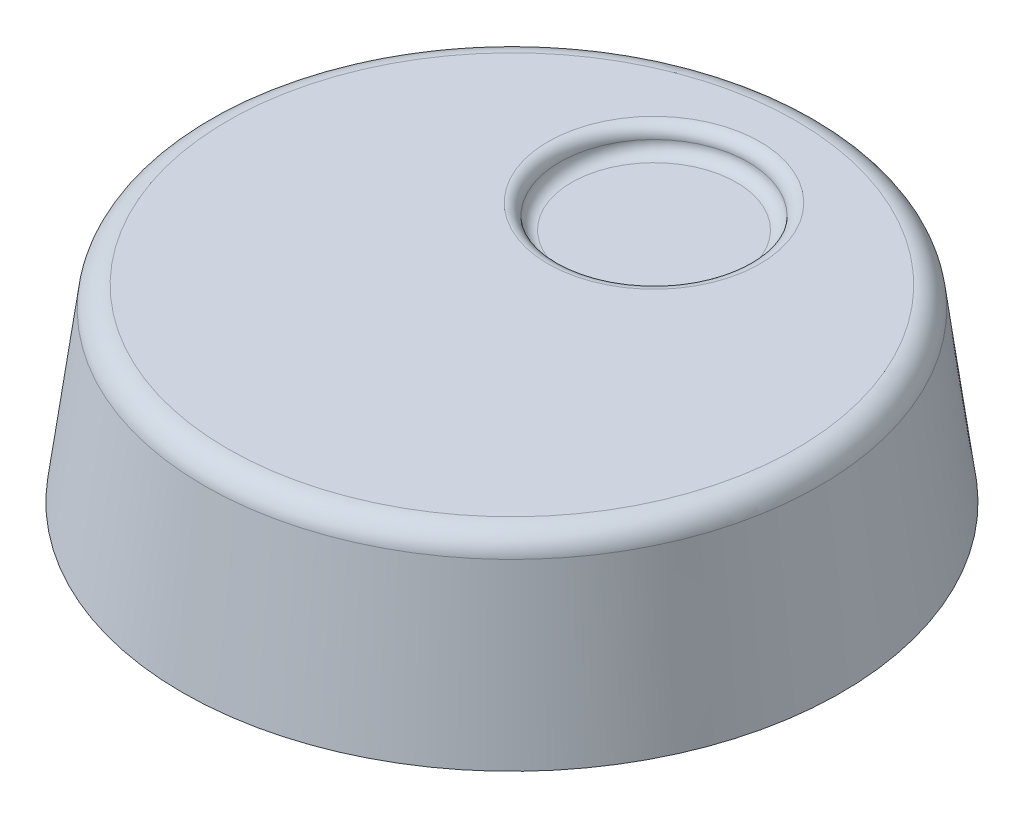
ISO-10303-21;
HEADER;
FILE_DESCRIPTION(('STEP AP214'),'2;1');
FILE_NAME('part.step','',(''),(''),'','','');
FILE_SCHEMA(('AUTOMOTIVE_DESIGN { 1 0 10303 214 1 1 1 1 }'));
ENDSEC;
DATA;
#1=APPLICATION_CONTEXT('core data for automotive mechanical design processes');
#2=APPLICATION_PROTOCOL_DEFINITION('international standard','automotive_design',2000,#1);
#3=PRODUCT_CONTEXT('',#1,'mechanical');
#4=PRODUCT('Part','Part','',(#3));
#5=PRODUCT_RELATED_PRODUCT_CATEGORY('part','',(#4));
#6=PRODUCT_DEFINITION_FORMATION('','',#4);
#7=PRODUCT_DEFINITION_CONTEXT('part definition',#1,'design');
#8=PRODUCT_DEFINITION('design','',#6,#7);
#9=PRODUCT_DEFINITION_SHAPE('','',#8);
#10=(LENGTH_UNIT() NAMED_UNIT(*) SI_UNIT(.MILLI.,.METRE.));
#11=(NAMED_UNIT(*) PLANE_ANGLE_UNIT() SI_UNIT($,.RADIAN.));
#12=(NAMED_UNIT(*) SI_UNIT($,.STERADIAN.) SOLID_ANGLE_UNIT());
#13=UNCERTAINTY_MEASURE_WITH_UNIT(LENGTH_MEASURE(1.E-05),#10,'distance_accuracy_value','');
#14=(GEOMETRIC_REPRESENTATION_CONTEXT(3) GLOBAL_UNCERTAINTY_ASSIGNED_CONTEXT((#13)) GLOBAL_UNIT_ASSIGNED_CONTEXT((#10,
#11,#12)) REPRESENTATION_CONTEXT('',''));
#15=CARTESIAN_POINT('',(0.,0.,0.));
#16=DIRECTION('',(0.,0.,1.));
#17=DIRECTION('',(1.,0.,0.));
#18=AXIS2_PLACEMENT_3D('',#15,#16,#17);
#19=CARTESIAN_POINT('',(-2.85114292872174,9.525,-1.397));
#20=DIRECTION('',(0.,0.,-1.));
#21=DIRECTION('',(-1.,0.,0.));
#22=AXIS2_PLACEMENT_3D('',#19,#20,#21);
#23=PLANE('',#22);
#24=DIRECTION('',(-1.,0.,0.));
#25=VECTOR('',#24,1.);
#26=CARTESIAN_POINT('',(-2.85114292872174,2.54,-1.397));
#27=LINE('',#26,#25);
#28=CARTESIAN_POINT('',(2.85114292872174,2.54,-1.397));
#29=VERTEX_POINT('',#28);
#30=CARTESIAN_POINT('',(-2.85114292872174,2.54,-1.397));
#31=VERTEX_POINT('',#30);
#32=EDGE_CURVE('E11',#29,#31,#27,.T.);
#33=ORIENTED_EDGE('',*,*,#32,.F.);
#34=DIRECTION('',(0.,-1.,0.));
#35=VECTOR('',#34,1.);
#36=CARTESIAN_POINT('',(2.85114292872174,9.525,-1.397));
#37=LINE('',#36,#35);
#38=CARTESIAN_POINT('',(2.85114292872174,9.525,-1.397));
#39=VERTEX_POINT('',#38);
#40=EDGE_CURVE('E57',#39,#29,#37,.T.);
#41=ORIENTED_EDGE('',*,*,#40,.F.);
#42=DIRECTION('',(1.,0.,0.));
#43=VECTOR('',#42,1.);
#44=CARTESIAN_POINT('',(-2.85114292872174,9.525,-1.397));
#45=LINE('',#44,#43);
#46=CARTESIAN_POINT('',(-2.85114292872174,9.525,-1.397));
#47=VERTEX_POINT('',#46);
#48=EDGE_CURVE('E72',#47,#39,#45,.T.);
#49=ORIENTED_EDGE('',*,*,#48,.F.);
#50=DIRECTION('',(0.,-1.,0.));
#51=VECTOR('',#50,1.);
#52=CARTESIAN_POINT('',(-2.85114292872174,9.525,-1.397));
#53=LINE('',#52,#51);
#54=EDGE_CURVE('E67',#47,#31,#53,.T.);
#55=ORIENTED_EDGE('',*,*,#54,.T.);
#56=EDGE_LOOP('',(#33,#41,#49,#55));
#57=FACE_BOUND('',#56,.T.);
#58=ADVANCED_FACE('F37',(#57),#23,.F.);
#59=CARTESIAN_POINT('',(0.,0.,0.));
#60=DIRECTION('',(0.,-1.,0.));
#61=DIRECTION('',(0.,0.,1.));
#62=AXIS2_PLACEMENT_3D('',#59,#60,#61);
#63=CONICAL_SURFACE('',#62,22.225,0.130899693899575);
#64=CARTESIAN_POINT('',(0.,11.3197103301493,0.));
#65=DIRECTION('',(0.,-1.,0.));
#66=DIRECTION('',(0.,0.,-1.));
#67=AXIS2_PLACEMENT_3D('',#64,#65,#66);
#68=CIRCLE('',#67,20.73473186307);
#69=CARTESIAN_POINT('',(0.,11.3197103301493,-20.73473186307));
#70=VERTEX_POINT('',#69);
#71=EDGE_CURVE('E86',#70,#70,#68,.T.);
#72=ORIENTED_EDGE('',*,*,#71,.T.);
#73=EDGE_LOOP('',(#72));
#74=FACE_BOUND('',#73,.T.);
#75=CARTESIAN_POINT('',(0.,0.,0.));
#76=DIRECTION('',(0.,1.,0.));
#77=DIRECTION('',(0.,0.,1.));
#78=AXIS2_PLACEMENT_3D('',#75,#76,#77);
#79=CIRCLE('',#78,22.225);
#80=CARTESIAN_POINT('',(0.,0.,22.225));
#81=VERTEX_POINT('',#80);
#82=EDGE_CURVE('E80',#81,#81,#79,.T.);
#83=ORIENTED_EDGE('',*,*,#82,.T.);
#84=EDGE_LOOP('',(#83));
#85=FACE_BOUND('',#84,.T.);
#86=ADVANCED_FACE('F111',(#74,#85),#63,.T.);
#87=CARTESIAN_POINT('',(0.,12.7,0.));
#88=DIRECTION('',(0.,1.,0.));
#89=DIRECTION('',(0.,0.,1.));
#90=AXIS2_PLACEMENT_3D('',#87,#88,#89);
#91=PLANE('',#90);
#92=CARTESIAN_POINT('',(0.,12.7,-9.58040657281953));
#93=DIRECTION('',(0.,1.,0.));
#94=DIRECTION('',(0.,0.,1.));
#95=AXIS2_PLACEMENT_3D('',#92,#93,#94);
#96=CIRCLE('',#95,7.14375);
#97=CARTESIAN_POINT('',(0.,12.7,-2.43665657281953));
#98=VERTEX_POINT('',#97);
#99=EDGE_CURVE('E89',#98,#98,#96,.F.);
#100=ORIENTED_EDGE('',*,*,#99,.T.);
#101=EDGE_LOOP('',(#100));
#102=FACE_BOUND('',#101,.T.);
#103=CARTESIAN_POINT('',(0.,12.7,0.));
#104=DIRECTION('',(0.,1.,0.));
#105=DIRECTION('',(0.,0.,1.));
#106=AXIS2_PLACEMENT_3D('',#103,#104,#105);
#107=CIRCLE('',#106,19.1608131456391);
#108=CARTESIAN_POINT('',(0.,12.7,19.1608131456391));
#109=VERTEX_POINT('',#108);
#110=EDGE_CURVE('E83',#109,#109,#107,.T.);
#111=ORIENTED_EDGE('',*,*,#110,.T.);
#112=EDGE_LOOP('',(#111));
#113=FACE_BOUND('',#112,.T.);
#114=ADVANCED_FACE('F116',(#102,#113),#91,.T.);
#115=CARTESIAN_POINT('',(0.,0.,0.));
#116=DIRECTION('',(0.,1.,0.));
#117=DIRECTION('',(0.,0.,1.));
#118=AXIS2_PLACEMENT_3D('',#115,#116,#117);
#119=PLANE('',#118);
#120=CARTESIAN_POINT('',(0.,0.,0.));
#121=DIRECTION('',(0.,-1.,0.));
#122=DIRECTION('',(0.,0.,-1.));
#123=AXIS2_PLACEMENT_3D('',#120,#121,#122);
#124=CIRCLE('',#123,3.175);
#125=CARTESIAN_POINT('',(0.,0.,-3.175));
#126=VERTEX_POINT('',#125);
#127=EDGE_CURVE('E69',#126,#126,#124,.T.);
#128=ORIENTED_EDGE('',*,*,#127,.F.);
#129=EDGE_LOOP('',(#128));
#130=FACE_BOUND('',#129,.T.);
#131=ORIENTED_EDGE('',*,*,#82,.F.);
#132=EDGE_LOOP('',(#131));
#133=FACE_BOUND('',#132,.T.);
#134=ADVANCED_FACE('F128',(#130,#133),#119,.F.);
#135=CARTESIAN_POINT('',(0.,11.1125,0.));
#136=DIRECTION('',(0.,1.,0.));
#137=DIRECTION('',(0.,0.,1.));
#138=AXIS2_PLACEMENT_3D('',#135,#136,#137);
#139=TOROIDAL_SURFACE('',#138,19.1608131456391,1.5875);
#140=ORIENTED_EDGE('',*,*,#71,.F.);
#141=EDGE_LOOP('',(#140));
#142=FACE_BOUND('',#141,.T.);
#143=ORIENTED_EDGE('',*,*,#110,.F.);
#144=EDGE_LOOP('',(#143));
#145=FACE_BOUND('',#144,.T.);
#146=ADVANCED_FACE('F106',(#142,#145),#139,.T.);
#147=CARTESIAN_POINT('',(0.,11.1125,-9.58040657281953));
#148=DIRECTION('',(0.,1.,0.));
#149=DIRECTION('',(0.,0.,1.));
#150=AXIS2_PLACEMENT_3D('',#147,#148,#149);
#151=PLANE('',#150);
#152=CARTESIAN_POINT('',(0.,11.1125,-9.58040657281953));
#153=DIRECTION('',(0.,1.,0.));
#154=DIRECTION('',(0.,0.,1.));
#155=AXIS2_PLACEMENT_3D('',#152,#153,#154);
#156=CIRCLE('',#155,5.55625);
#157=CARTESIAN_POINT('',(0.,11.1125,-4.02415657281953));
#158=VERTEX_POINT('',#157);
#159=EDGE_CURVE('E45',#158,#158,#156,.T.);
#160=ORIENTED_EDGE('',*,*,#159,.T.);
#161=EDGE_LOOP('',(#160));
#162=FACE_BOUND('',#161,.T.);
#163=ADVANCED_FACE('F99',(#162),#151,.T.);
#164=CARTESIAN_POINT('',(0.,11.90625,-9.58040657281953));
#165=DIRECTION('',(0.,1.,0.));
#166=DIRECTION('',(0.,0.,1.));
#167=AXIS2_PLACEMENT_3D('',#164,#165,#166);
#168=TOROIDAL_SURFACE('',#167,5.55625,0.79375);
#169=ORIENTED_EDGE('',*,*,#159,.F.);
#170=EDGE_LOOP('',(#169));
#171=FACE_BOUND('',#170,.T.);
#172=CARTESIAN_POINT('',(0.,11.90625,-9.58040657281953));
#173=DIRECTION('',(0.,1.,0.));
#174=DIRECTION('',(0.,0.,1.));
#175=AXIS2_PLACEMENT_3D('',#172,#173,#174);
#176=CIRCLE('',#175,6.35);
#177=CARTESIAN_POINT('',(0.,11.90625,-3.23040657281953));
#178=VERTEX_POINT('',#177);
#179=EDGE_CURVE('E74',#178,#178,#176,.F.);
#180=ORIENTED_EDGE('',*,*,#179,.F.);
#181=EDGE_LOOP('',(#180));
#182=FACE_BOUND('',#181,.T.);
#183=ADVANCED_FACE('F39',(#171,#182),#168,.F.);
#184=CARTESIAN_POINT('',(0.,11.90625,-9.58040657281953));
#185=DIRECTION('',(0.,1.,0.));
#186=DIRECTION('',(0.,0.,1.));
#187=AXIS2_PLACEMENT_3D('',#184,#185,#186);
#188=TOROIDAL_SURFACE('',#187,7.14375,0.79375);
#189=ORIENTED_EDGE('',*,*,#99,.F.);
#190=EDGE_LOOP('',(#189));
#191=FACE_BOUND('',#190,.T.);
#192=ORIENTED_EDGE('',*,*,#179,.T.);
#193=EDGE_LOOP('',(#192));
#194=FACE_BOUND('',#193,.T.);
#195=ADVANCED_FACE('F96',(#191,#194),#188,.T.);
#196=CARTESIAN_POINT('',(0.,9.525,0.));
#197=DIRECTION('',(0.,-1.,0.));
#198=DIRECTION('',(0.,0.,-1.));
#199=AXIS2_PLACEMENT_3D('',#196,#197,#198);
#200=CYLINDRICAL_SURFACE('',#199,3.175);
#201=ORIENTED_EDGE('',*,*,#127,.T.);
#202=EDGE_LOOP('',(#201));
#203=FACE_BOUND('',#202,.T.);
#204=CARTESIAN_POINT('',(0.,2.54,0.));
#205=DIRECTION('',(0.,-1.,0.));
#206=DIRECTION('',(0.,0.,-1.));
#207=AXIS2_PLACEMENT_3D('',#204,#205,#206);
#208=CIRCLE('',#207,3.175);
#209=EDGE_CURVE('E50',#31,#29,#208,.T.);
#210=ORIENTED_EDGE('',*,*,#209,.F.);
#211=ORIENTED_EDGE('',*,*,#54,.F.);
#212=CARTESIAN_POINT('',(0.,9.525,0.));
#213=DIRECTION('',(0.,-1.,0.));
#214=DIRECTION('',(0.,0.,-1.));
#215=AXIS2_PLACEMENT_3D('',#212,#213,#214);
#216=CIRCLE('',#215,3.175);
#217=EDGE_CURVE('E76',#39,#47,#216,.T.);
#218=ORIENTED_EDGE('',*,*,#217,.F.);
#219=ORIENTED_EDGE('',*,*,#40,.T.);
#220=EDGE_LOOP('',(#210,#211,#218,#219));
#221=FACE_BOUND('',#220,.T.);
#222=ADVANCED_FACE('F66',(#203,#221),#200,.F.);
#223=CARTESIAN_POINT('',(0.,9.525,0.));
#224=DIRECTION('',(0.,-1.,0.));
#225=DIRECTION('',(0.,0.,-1.));
#226=AXIS2_PLACEMENT_3D('',#223,#224,#225);
#227=PLANE('',#226);
#228=ORIENTED_EDGE('',*,*,#217,.T.);
#229=ORIENTED_EDGE('',*,*,#48,.T.);
#230=EDGE_LOOP('',(#228,#229));
#231=FACE_BOUND('',#230,.T.);
#232=ADVANCED_FACE('F121',(#231),#227,.T.);
#233=CARTESIAN_POINT('',(0.,2.54,0.));
#234=DIRECTION('',(0.,-1.,0.));
#235=DIRECTION('',(0.,0.,-1.));
#236=AXIS2_PLACEMENT_3D('',#233,#234,#235);
#237=PLANE('',#236);
#238=ORIENTED_EDGE('',*,*,#32,.T.);
#239=ORIENTED_EDGE('',*,*,#209,.T.);
#240=EDGE_LOOP('',(#238,#239));
#241=FACE_BOUND('',#240,.T.);
#242=ADVANCED_FACE('F63',(#241),#237,.T.);
#243=CLOSED_SHELL('',(#58,#86,#114,#134,#146,#163,#183,#195,#222,#232,#242));
#244=MANIFOLD_SOLID_BREP('B2',#243);
#245=ADVANCED_BREP_SHAPE_REPRESENTATION('',(#18,#244),#14);
#246=SHAPE_DEFINITION_REPRESENTATION(#9,#245);
ENDSEC;
END-ISO-10303-21;
